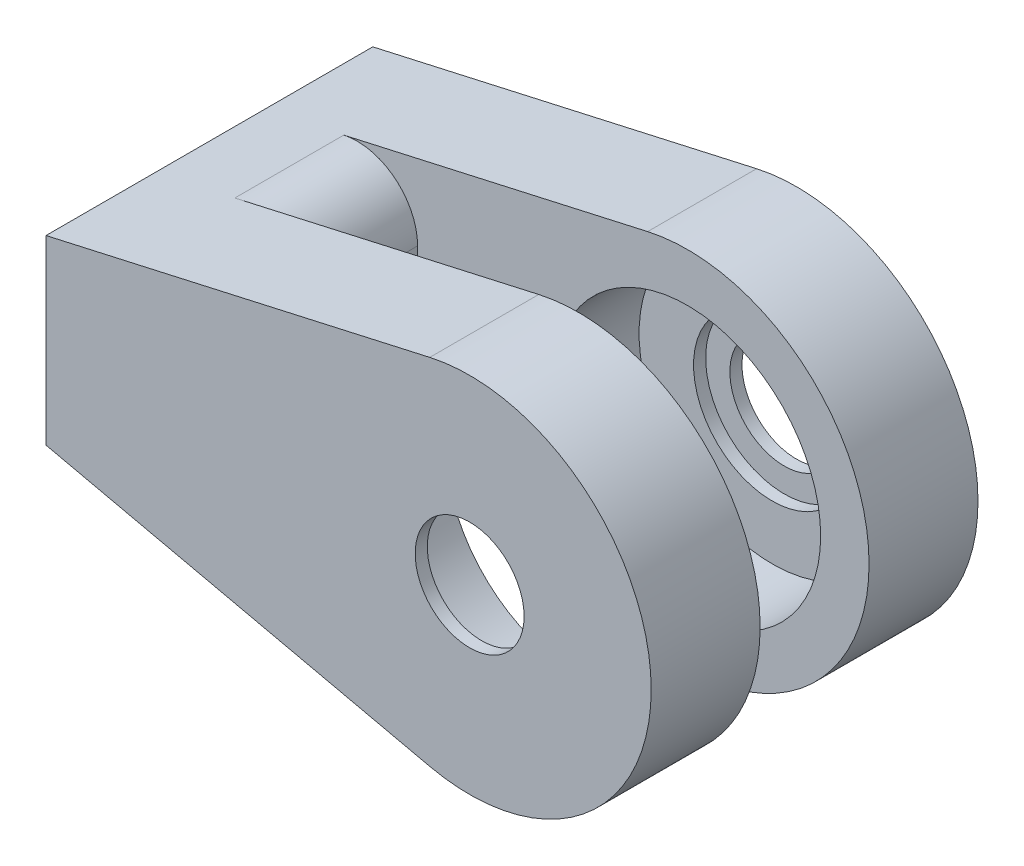
ISO-10303-21;
HEADER;
FILE_DESCRIPTION(('STEP AP214'),'2;1');
FILE_NAME('part.step','',(''),(''),'','','');
FILE_SCHEMA(('AUTOMOTIVE_DESIGN { 1 0 10303 214 1 1 1 1 }'));
ENDSEC;
DATA;
#1=APPLICATION_CONTEXT('core data for automotive mechanical design processes');
#2=APPLICATION_PROTOCOL_DEFINITION('international standard','automotive_design',2000,#1);
#3=PRODUCT_CONTEXT('',#1,'mechanical');
#4=PRODUCT('Part','Part','',(#3));
#5=PRODUCT_RELATED_PRODUCT_CATEGORY('part','',(#4));
#6=PRODUCT_DEFINITION_FORMATION('','',#4);
#7=PRODUCT_DEFINITION_CONTEXT('part definition',#1,'design');
#8=PRODUCT_DEFINITION('design','',#6,#7);
#9=PRODUCT_DEFINITION_SHAPE('','',#8);
#10=(LENGTH_UNIT() NAMED_UNIT(*) SI_UNIT(.MILLI.,.METRE.));
#11=(NAMED_UNIT(*) PLANE_ANGLE_UNIT() SI_UNIT($,.RADIAN.));
#12=(NAMED_UNIT(*) SI_UNIT($,.STERADIAN.) SOLID_ANGLE_UNIT());
#13=UNCERTAINTY_MEASURE_WITH_UNIT(LENGTH_MEASURE(1.E-05),#10,'distance_accuracy_value','');
#14=(GEOMETRIC_REPRESENTATION_CONTEXT(3) GLOBAL_UNCERTAINTY_ASSIGNED_CONTEXT((#13)) GLOBAL_UNIT_ASSIGNED_CONTEXT((#10,
#11,#12)) REPRESENTATION_CONTEXT('',''));
#15=CARTESIAN_POINT('',(0.,0.,0.));
#16=DIRECTION('',(0.,0.,1.));
#17=DIRECTION('',(1.,0.,0.));
#18=AXIS2_PLACEMENT_3D('',#15,#16,#17);
#19=CARTESIAN_POINT('',(0.,0.,-0.00100000000000013));
#20=DIRECTION('',(0.,0.,1.));
#21=DIRECTION('',(1.,0.,0.));
#22=AXIS2_PLACEMENT_3D('',#19,#20,#21);
#23=CYLINDRICAL_SURFACE('',#22,4.5);
#24=CARTESIAN_POINT('',(0.,0.,0.));
#25=DIRECTION('',(0.,0.,1.));
#26=DIRECTION('',(1.,0.,0.));
#27=AXIS2_PLACEMENT_3D('',#24,#25,#26);
#28=CIRCLE('',#27,4.5);
#29=CARTESIAN_POINT('',(4.5,0.,0.));
#30=VERTEX_POINT('',#29);
#31=EDGE_CURVE('E152',#30,#30,#28,.F.);
#32=ORIENTED_EDGE('',*,*,#31,.T.);
#33=EDGE_LOOP('',(#32));
#34=FACE_BOUND('',#33,.T.);
#35=CARTESIAN_POINT('',(0.,0.,1.));
#36=DIRECTION('',(0.,0.,1.));
#37=DIRECTION('',(1.,0.,0.));
#38=AXIS2_PLACEMENT_3D('',#35,#36,#37);
#39=CIRCLE('',#38,4.5);
#40=CARTESIAN_POINT('',(4.5,0.,1.));
#41=VERTEX_POINT('',#40);
#42=EDGE_CURVE('E48',#41,#41,#39,.F.);
#43=ORIENTED_EDGE('',*,*,#42,.F.);
#44=EDGE_LOOP('',(#43));
#45=FACE_BOUND('',#44,.T.);
#46=ADVANCED_FACE('F44',(#34,#45),#23,.F.);
#47=CARTESIAN_POINT('',(0.,0.,9.));
#48=DIRECTION('',(0.,0.,1.));
#49=DIRECTION('',(1.,0.,0.));
#50=AXIS2_PLACEMENT_3D('',#47,#48,#49);
#51=PLANE('',#50);
#52=CARTESIAN_POINT('',(0.,0.,9.));
#53=DIRECTION('',(0.,0.,1.));
#54=DIRECTION('',(1.,0.,0.));
#55=AXIS2_PLACEMENT_3D('',#52,#53,#54);
#56=CIRCLE('',#55,11.);
#57=CARTESIAN_POINT('',(11.,0.,9.));
#58=VERTEX_POINT('',#57);
#59=EDGE_CURVE('E156',#58,#58,#56,.T.);
#60=ORIENTED_EDGE('',*,*,#59,.F.);
#61=EDGE_LOOP('',(#60));
#62=FACE_BOUND('',#61,.T.);
#63=DIRECTION('',(-0.975609756097561,-0.219512195121951,0.));
#64=VECTOR('',#63,1.);
#65=CARTESIAN_POINT('',(-3.29268292682927,14.6341463414634,9.));
#66=LINE('',#65,#64);
#67=CARTESIAN_POINT('',(-3.29268292682927,14.6341463414634,9.));
#68=VERTEX_POINT('',#67);
#69=CARTESIAN_POINT('',(-28.3975609756098,8.9855487804878,9.));
#70=VERTEX_POINT('',#69);
#71=EDGE_CURVE('E167',#68,#70,#66,.T.);
#72=ORIENTED_EDGE('',*,*,#71,.T.);
#73=CARTESIAN_POINT('',(-27.3,4.1075,9.));
#74=DIRECTION('',(0.,0.,1.));
#75=DIRECTION('',(1.,0.,0.));
#76=AXIS2_PLACEMENT_3D('',#73,#74,#75);
#77=CIRCLE('',#76,5.);
#78=CARTESIAN_POINT('',(-22.3,4.1075,9.));
#79=VERTEX_POINT('',#78);
#80=EDGE_CURVE('E197',#70,#79,#77,.F.);
#81=ORIENTED_EDGE('',*,*,#80,.T.);
#82=DIRECTION('',(0.,-1.,0.));
#83=VECTOR('',#82,1.);
#84=CARTESIAN_POINT('',(-22.3,0.,9.));
#85=LINE('',#84,#83);
#86=CARTESIAN_POINT('',(-22.3,-4.1075,9.));
#87=VERTEX_POINT('',#86);
#88=EDGE_CURVE('E146',#79,#87,#85,.T.);
#89=ORIENTED_EDGE('',*,*,#88,.T.);
#90=CARTESIAN_POINT('',(-27.3,-4.1075,9.));
#91=DIRECTION('',(0.,0.,1.));
#92=DIRECTION('',(1.,0.,0.));
#93=AXIS2_PLACEMENT_3D('',#90,#91,#92);
#94=CIRCLE('',#93,5.);
#95=CARTESIAN_POINT('',(-28.3975609756098,-8.98554878048781,9.));
#96=VERTEX_POINT('',#95);
#97=EDGE_CURVE('E53',#87,#96,#94,.F.);
#98=ORIENTED_EDGE('',*,*,#97,.T.);
#99=DIRECTION('',(0.975609756097561,-0.219512195121951,0.));
#100=VECTOR('',#99,1.);
#101=CARTESIAN_POINT('',(-3.29268292682927,-14.6341463414634,9.));
#102=LINE('',#101,#100);
#103=CARTESIAN_POINT('',(-3.29268292682927,-14.6341463414634,9.));
#104=VERTEX_POINT('',#103);
#105=EDGE_CURVE('E61',#96,#104,#102,.T.);
#106=ORIENTED_EDGE('',*,*,#105,.T.);
#107=CARTESIAN_POINT('',(0.,0.,9.));
#108=DIRECTION('',(0.,0.,1.));
#109=DIRECTION('',(1.,0.,0.));
#110=AXIS2_PLACEMENT_3D('',#107,#108,#109);
#111=CIRCLE('',#110,15.);
#112=EDGE_CURVE('E164',#104,#68,#111,.T.);
#113=ORIENTED_EDGE('',*,*,#112,.T.);
#114=EDGE_LOOP('',(#72,#81,#89,#98,#106,#113));
#115=FACE_BOUND('',#114,.T.);
#116=ADVANCED_FACE('F255',(#62,#115),#51,.T.);
#117=CARTESIAN_POINT('',(-3.29268292682927,-14.6341463414634,9.));
#118=DIRECTION('',(0.219512195121951,0.975609756097561,0.));
#119=DIRECTION('',(-0.975609756097561,0.219512195121951,0.));
#120=AXIS2_PLACEMENT_3D('',#117,#118,#119);
#121=PLANE('',#120);
#122=ORIENTED_EDGE('',*,*,#105,.F.);
#123=DIRECTION('',(0.,0.,-1.));
#124=VECTOR('',#123,1.);
#125=CARTESIAN_POINT('',(-28.3975609756098,-8.98554878048781,18.));
#126=LINE('',#125,#124);
#127=CARTESIAN_POINT('',(-28.3975609756098,-8.98554878048781,18.));
#128=VERTEX_POINT('',#127);
#129=EDGE_CURVE('E126',#96,#128,#126,.F.);
#130=ORIENTED_EDGE('',*,*,#129,.T.);
#131=DIRECTION('',(0.975609756097561,-0.219512195121951,0.));
#132=VECTOR('',#131,1.);
#133=CARTESIAN_POINT('',(-3.29268292682927,-14.6341463414634,18.));
#134=LINE('',#133,#132);
#135=CARTESIAN_POINT('',(-3.29268292682927,-14.6341463414634,18.));
#136=VERTEX_POINT('',#135);
#137=EDGE_CURVE('E68',#128,#136,#134,.T.);
#138=ORIENTED_EDGE('',*,*,#137,.T.);
#139=DIRECTION('',(0.,0.,1.));
#140=VECTOR('',#139,1.);
#141=CARTESIAN_POINT('',(-3.29268292682927,-14.6341463414634,18.));
#142=LINE('',#141,#140);
#143=CARTESIAN_POINT('',(-3.29268292682927,-14.6341463414634,27.));
#144=VERTEX_POINT('',#143);
#145=EDGE_CURVE('E123',#136,#144,#142,.T.);
#146=ORIENTED_EDGE('',*,*,#145,.T.);
#147=DIRECTION('',(0.975609756097561,-0.219512195121951,0.));
#148=VECTOR('',#147,1.);
#149=CARTESIAN_POINT('',(-3.29268292682927,-14.6341463414634,27.));
#150=LINE('',#149,#148);
#151=CARTESIAN_POINT('',(-35.,-7.50000000000001,27.));
#152=VERTEX_POINT('',#151);
#153=EDGE_CURVE('E232',#152,#144,#150,.T.);
#154=ORIENTED_EDGE('',*,*,#153,.F.);
#155=DIRECTION('',(0.,0.,-1.));
#156=VECTOR('',#155,1.);
#157=CARTESIAN_POINT('',(-35.,-7.50000000000001,9.));
#158=LINE('',#157,#156);
#159=CARTESIAN_POINT('',(-35.,-7.50000000000001,0.));
#160=VERTEX_POINT('',#159);
#161=EDGE_CURVE('E169',#152,#160,#158,.T.);
#162=ORIENTED_EDGE('',*,*,#161,.T.);
#163=DIRECTION('',(0.975609756097561,-0.219512195121951,0.));
#164=VECTOR('',#163,1.);
#165=CARTESIAN_POINT('',(-3.29268292682927,-14.6341463414634,0.));
#166=LINE('',#165,#164);
#167=CARTESIAN_POINT('',(-3.29268292682927,-14.6341463414634,0.));
#168=VERTEX_POINT('',#167);
#169=EDGE_CURVE('E162',#160,#168,#166,.T.);
#170=ORIENTED_EDGE('',*,*,#169,.T.);
#171=DIRECTION('',(0.,0.,-1.));
#172=VECTOR('',#171,1.);
#173=CARTESIAN_POINT('',(-3.29268292682927,-14.6341463414634,9.));
#174=LINE('',#173,#172);
#175=EDGE_CURVE('E185',#104,#168,#174,.T.);
#176=ORIENTED_EDGE('',*,*,#175,.F.);
#177=EDGE_LOOP('',(#122,#130,#138,#146,#154,#162,#170,#176));
#178=FACE_BOUND('',#177,.T.);
#179=ADVANCED_FACE('F120',(#178),#121,.F.);
#180=CARTESIAN_POINT('',(0.,0.,9.));
#181=DIRECTION('',(0.,0.,-1.));
#182=DIRECTION('',(-1.,0.,0.));
#183=AXIS2_PLACEMENT_3D('',#180,#181,#182);
#184=CYLINDRICAL_SURFACE('',#183,15.);
#185=CARTESIAN_POINT('',(0.,0.,0.));
#186=DIRECTION('',(0.,0.,1.));
#187=DIRECTION('',(1.,0.,0.));
#188=AXIS2_PLACEMENT_3D('',#185,#186,#187);
#189=CIRCLE('',#188,15.);
#190=CARTESIAN_POINT('',(-3.29268292682927,14.6341463414634,0.));
#191=VERTEX_POINT('',#190);
#192=EDGE_CURVE('E172',#168,#191,#189,.T.);
#193=ORIENTED_EDGE('',*,*,#192,.T.);
#194=DIRECTION('',(0.,0.,-1.));
#195=VECTOR('',#194,1.);
#196=CARTESIAN_POINT('',(-3.29268292682927,14.6341463414634,9.));
#197=LINE('',#196,#195);
#198=EDGE_CURVE('E182',#68,#191,#197,.T.);
#199=ORIENTED_EDGE('',*,*,#198,.F.);
#200=ORIENTED_EDGE('',*,*,#112,.F.);
#201=ORIENTED_EDGE('',*,*,#175,.T.);
#202=EDGE_LOOP('',(#193,#199,#200,#201));
#203=FACE_BOUND('',#202,.T.);
#204=ADVANCED_FACE('F252',(#203),#184,.T.);
#205=CARTESIAN_POINT('',(-3.29268292682927,14.6341463414634,9.));
#206=DIRECTION('',(0.219512195121951,-0.975609756097561,0.));
#207=DIRECTION('',(0.975609756097561,0.219512195121951,0.));
#208=AXIS2_PLACEMENT_3D('',#205,#206,#207);
#209=PLANE('',#208);
#210=DIRECTION('',(0.,0.,-1.));
#211=VECTOR('',#210,1.);
#212=CARTESIAN_POINT('',(-28.3975609756098,8.9855487804878,9.));
#213=LINE('',#212,#211);
#214=CARTESIAN_POINT('',(-28.3975609756098,8.9855487804878,18.));
#215=VERTEX_POINT('',#214);
#216=EDGE_CURVE('E188',#215,#70,#213,.T.);
#217=ORIENTED_EDGE('',*,*,#216,.T.);
#218=ORIENTED_EDGE('',*,*,#71,.F.);
#219=ORIENTED_EDGE('',*,*,#198,.T.);
#220=DIRECTION('',(-0.975609756097561,-0.219512195121951,0.));
#221=VECTOR('',#220,1.);
#222=CARTESIAN_POINT('',(-3.29268292682927,14.6341463414634,0.));
#223=LINE('',#222,#221);
#224=CARTESIAN_POINT('',(-35.,7.49999999999999,0.));
#225=VERTEX_POINT('',#224);
#226=EDGE_CURVE('E174',#191,#225,#223,.T.);
#227=ORIENTED_EDGE('',*,*,#226,.T.);
#228=DIRECTION('',(0.,0.,-1.));
#229=VECTOR('',#228,1.);
#230=CARTESIAN_POINT('',(-35.,7.49999999999999,9.));
#231=LINE('',#230,#229);
#232=CARTESIAN_POINT('',(-35.,7.49999999999999,27.));
#233=VERTEX_POINT('',#232);
#234=EDGE_CURVE('E179',#233,#225,#231,.T.);
#235=ORIENTED_EDGE('',*,*,#234,.F.);
#236=DIRECTION('',(-0.975609756097561,-0.219512195121951,0.));
#237=VECTOR('',#236,1.);
#238=CARTESIAN_POINT('',(-3.29268292682927,14.6341463414634,27.));
#239=LINE('',#238,#237);
#240=CARTESIAN_POINT('',(-3.29268292682927,14.6341463414634,27.));
#241=VERTEX_POINT('',#240);
#242=EDGE_CURVE('E237',#241,#233,#239,.T.);
#243=ORIENTED_EDGE('',*,*,#242,.F.);
#244=DIRECTION('',(0.,0.,1.));
#245=VECTOR('',#244,1.);
#246=CARTESIAN_POINT('',(-3.29268292682927,14.6341463414634,18.));
#247=LINE('',#246,#245);
#248=CARTESIAN_POINT('',(-3.29268292682927,14.6341463414634,18.));
#249=VERTEX_POINT('',#248);
#250=EDGE_CURVE('E143',#249,#241,#247,.T.);
#251=ORIENTED_EDGE('',*,*,#250,.F.);
#252=DIRECTION('',(-0.975609756097561,-0.219512195121951,0.));
#253=VECTOR('',#252,1.);
#254=CARTESIAN_POINT('',(-3.29268292682927,14.6341463414634,18.));
#255=LINE('',#254,#253);
#256=EDGE_CURVE('E134',#249,#215,#255,.T.);
#257=ORIENTED_EDGE('',*,*,#256,.T.);
#258=EDGE_LOOP('',(#217,#218,#219,#227,#235,#243,#251,#257));
#259=FACE_BOUND('',#258,.T.);
#260=ADVANCED_FACE('F269',(#259),#209,.F.);
#261=CARTESIAN_POINT('',(-35.,0.,9.));
#262=DIRECTION('',(1.,0.,0.));
#263=DIRECTION('',(0.,1.,0.));
#264=AXIS2_PLACEMENT_3D('',#261,#262,#263);
#265=PLANE('',#264);
#266=CARTESIAN_POINT('',(-35.,0.,13.5));
#267=DIRECTION('',(-1.,0.,0.));
#268=DIRECTION('',(0.,0.,1.));
#269=AXIS2_PLACEMENT_3D('',#266,#267,#268);
#270=CIRCLE('',#269,5.03125);
#271=CARTESIAN_POINT('',(-35.,0.,18.53125));
#272=VERTEX_POINT('',#271);
#273=EDGE_CURVE('E215',#272,#272,#270,.T.);
#274=ORIENTED_EDGE('',*,*,#273,.F.);
#275=EDGE_LOOP('',(#274));
#276=FACE_BOUND('',#275,.T.);
#277=DIRECTION('',(0.,-1.,0.));
#278=VECTOR('',#277,1.);
#279=CARTESIAN_POINT('',(-35.,0.,0.));
#280=LINE('',#279,#278);
#281=EDGE_CURVE('E165',#225,#160,#280,.T.);
#282=ORIENTED_EDGE('',*,*,#281,.T.);
#283=ORIENTED_EDGE('',*,*,#161,.F.);
#284=DIRECTION('',(0.,-1.,0.));
#285=VECTOR('',#284,1.);
#286=CARTESIAN_POINT('',(-35.,0.,27.));
#287=LINE('',#286,#285);
#288=EDGE_CURVE('E129',#233,#152,#287,.T.);
#289=ORIENTED_EDGE('',*,*,#288,.F.);
#290=ORIENTED_EDGE('',*,*,#234,.T.);
#291=EDGE_LOOP('',(#282,#283,#289,#290));
#292=FACE_BOUND('',#291,.T.);
#293=ADVANCED_FACE('F270',(#276,#292),#265,.F.);
#294=CARTESIAN_POINT('',(0.,0.,0.));
#295=DIRECTION('',(0.,0.,1.));
#296=DIRECTION('',(1.,0.,0.));
#297=AXIS2_PLACEMENT_3D('',#294,#295,#296);
#298=PLANE('',#297);
#299=ORIENTED_EDGE('',*,*,#31,.F.);
#300=EDGE_LOOP('',(#299));
#301=FACE_BOUND('',#300,.T.);
#302=ORIENTED_EDGE('',*,*,#169,.F.);
#303=ORIENTED_EDGE('',*,*,#281,.F.);
#304=ORIENTED_EDGE('',*,*,#226,.F.);
#305=ORIENTED_EDGE('',*,*,#192,.F.);
#306=EDGE_LOOP('',(#302,#303,#304,#305));
#307=FACE_BOUND('',#306,.T.);
#308=ADVANCED_FACE('F247',(#301,#307),#298,.F.);
#309=CARTESIAN_POINT('',(0.,0.,-31.1126983722081));
#310=DIRECTION('',(0.,0.,1.));
#311=DIRECTION('',(1.,0.,0.));
#312=AXIS2_PLACEMENT_3D('',#309,#310,#311);
#313=CYLINDRICAL_SURFACE('',#312,11.);
#314=CARTESIAN_POINT('',(0.,0.,2.));
#315=DIRECTION('',(0.,0.,1.));
#316=DIRECTION('',(1.,0.,0.));
#317=AXIS2_PLACEMENT_3D('',#314,#315,#316);
#318=CIRCLE('',#317,11.);
#319=CARTESIAN_POINT('',(11.,0.,1.99999999999999));
#320=VERTEX_POINT('',#319);
#321=EDGE_CURVE('E159',#320,#320,#318,.F.);
#322=CARTESIAN_POINT('',(11.,0.,1.99999999999999));
#323=CARTESIAN_POINT('',(11.,0.,2.07291666666666));
#324=CARTESIAN_POINT('',(11.,0.,2.14583333333333));
#325=CARTESIAN_POINT('',(11.,0.,2.29166666666666));
#326=CARTESIAN_POINT('',(11.,0.,2.36458333333333));
#327=CARTESIAN_POINT('',(11.,0.,2.51041666666666));
#328=CARTESIAN_POINT('',(11.,0.,2.58333333333333));
#329=CARTESIAN_POINT('',(11.,0.,2.72916666666666));
#330=CARTESIAN_POINT('',(11.,0.,2.80208333333333));
#331=CARTESIAN_POINT('',(11.,0.,2.94791666666666));
#332=CARTESIAN_POINT('',(11.,0.,3.02083333333333));
#333=CARTESIAN_POINT('',(11.,0.,3.16666666666666));
#334=CARTESIAN_POINT('',(11.,0.,3.23958333333333));
#335=CARTESIAN_POINT('',(11.,0.,3.38541666666666));
#336=CARTESIAN_POINT('',(11.,0.,3.45833333333333));
#337=CARTESIAN_POINT('',(11.,0.,3.60416666666666));
#338=CARTESIAN_POINT('',(11.,0.,3.67708333333333));
#339=CARTESIAN_POINT('',(11.,0.,3.82291666666666));
#340=CARTESIAN_POINT('',(11.,0.,3.89583333333333));
#341=CARTESIAN_POINT('',(11.,0.,4.04166666666667));
#342=CARTESIAN_POINT('',(11.,0.,4.11458333333333));
#343=CARTESIAN_POINT('',(11.,0.,4.26041666666666));
#344=CARTESIAN_POINT('',(11.,0.,4.33333333333333));
#345=CARTESIAN_POINT('',(11.,0.,4.47916666666666));
#346=CARTESIAN_POINT('',(11.,0.,4.55208333333333));
#347=CARTESIAN_POINT('',(11.,0.,4.69791666666667));
#348=CARTESIAN_POINT('',(11.,0.,4.77083333333333));
#349=CARTESIAN_POINT('',(11.,0.,4.91666666666667));
#350=CARTESIAN_POINT('',(11.,0.,4.98958333333333));
#351=CARTESIAN_POINT('',(11.,0.,5.13541666666666));
#352=CARTESIAN_POINT('',(11.,0.,5.20833333333333));
#353=CARTESIAN_POINT('',(11.,0.,5.35416666666666));
#354=CARTESIAN_POINT('',(11.,0.,5.42708333333333));
#355=CARTESIAN_POINT('',(11.,0.,5.57291666666667));
#356=CARTESIAN_POINT('',(11.,0.,5.64583333333333));
#357=CARTESIAN_POINT('',(11.,0.,5.79166666666667));
#358=CARTESIAN_POINT('',(11.,0.,5.86458333333333));
#359=CARTESIAN_POINT('',(11.,0.,6.01041666666666));
#360=CARTESIAN_POINT('',(11.,0.,6.08333333333333));
#361=CARTESIAN_POINT('',(11.,0.,6.22916666666666));
#362=CARTESIAN_POINT('',(11.,0.,6.30208333333333));
#363=CARTESIAN_POINT('',(11.,0.,6.44791666666667));
#364=CARTESIAN_POINT('',(11.,0.,6.52083333333333));
#365=CARTESIAN_POINT('',(11.,0.,6.66666666666667));
#366=CARTESIAN_POINT('',(11.,0.,6.73958333333333));
#367=CARTESIAN_POINT('',(11.,0.,6.88541666666666));
#368=CARTESIAN_POINT('',(11.,0.,6.95833333333333));
#369=CARTESIAN_POINT('',(11.,0.,7.10416666666666));
#370=CARTESIAN_POINT('',(11.,0.,7.17708333333333));
#371=CARTESIAN_POINT('',(11.,0.,7.32291666666667));
#372=CARTESIAN_POINT('',(11.,0.,7.39583333333333));
#373=CARTESIAN_POINT('',(11.,0.,7.54166666666667));
#374=CARTESIAN_POINT('',(11.,0.,7.61458333333333));
#375=CARTESIAN_POINT('',(11.,0.,7.76041666666667));
#376=CARTESIAN_POINT('',(11.,0.,7.83333333333333));
#377=CARTESIAN_POINT('',(11.,0.,7.97916666666666));
#378=CARTESIAN_POINT('',(11.,0.,8.05208333333333));
#379=CARTESIAN_POINT('',(11.,0.,8.19791666666667));
#380=CARTESIAN_POINT('',(11.,0.,8.27083333333334));
#381=CARTESIAN_POINT('',(11.,0.,8.41666666666667));
#382=CARTESIAN_POINT('',(11.,0.,8.48958333333334));
#383=CARTESIAN_POINT('',(11.,0.,8.63541666666667));
#384=CARTESIAN_POINT('',(11.,0.,8.70833333333333));
#385=CARTESIAN_POINT('',(11.,0.,8.85416666666666));
#386=CARTESIAN_POINT('',(11.,0.,8.92708333333333));
#387=CARTESIAN_POINT('',(11.,0.,9.));
#388=B_SPLINE_CURVE_WITH_KNOTS('',3,(#322,#323,#324,#325,#326,#327,#328,#329,#330,#331,#332,
#333,#334,#335,#336,#337,#338,#339,#340,#341,#342,#343,#344,#345,#346,#347,#348,#349,#350,#351,
#352,#353,#354,#355,#356,#357,#358,#359,#360,#361,#362,#363,#364,#365,#366,#367,#368,#369,#370,
#371,#372,#373,#374,#375,#376,#377,#378,#379,#380,#381,#382,#383,#384,#385,#386,#387),
.UNSPECIFIED.,.F.,.F.,(4,2,2,2,2,2,2,2,2,2,2,2,2,2,2,2,2,2,2,2,2,2,2,2,2,2,2,2,2,2,2,2,4),(0.,
0.218750000000004,0.4375,0.656249999999997,0.875000000000001,1.09375,1.3125,1.53125,1.75,
1.96875000000001,2.1875,2.40625,2.625,2.84375000000001,3.0625,3.28125,3.5,3.71875000000001,
3.9375,4.15625,4.375,4.59375000000001,4.8125,5.03125,5.25,5.46875000000001,5.68750000000001,
5.90625,6.12500000000001,6.34375000000001,6.56250000000001,6.78125,7.00000000000001),.UNSPECIFIED.);
#389=EDGE_CURVE('BSEAM279',#320,#58,#388,.T.);
#390=ORIENTED_EDGE('',*,*,#321,.T.);
#391=ORIENTED_EDGE('',*,*,#59,.T.);
#392=ORIENTED_EDGE('',*,*,#389,.T.);
#393=ORIENTED_EDGE('',*,*,#389,.F.);
#394=EDGE_LOOP('',(#390,#392,#391,#393));
#395=FACE_BOUND('',#394,.T.);
#396=ADVANCED_FACE('F279',(#395),#313,.F.);
#397=CARTESIAN_POINT('',(0.,0.,2.));
#398=DIRECTION('',(0.,0.,1.));
#399=DIRECTION('',(1.,0.,0.));
#400=AXIS2_PLACEMENT_3D('',#397,#398,#399);
#401=PLANE('',#400);
#402=CARTESIAN_POINT('',(0.,0.,2.));
#403=DIRECTION('',(0.,0.,1.));
#404=DIRECTION('',(1.,0.,0.));
#405=AXIS2_PLACEMENT_3D('',#402,#403,#404);
#406=CIRCLE('',#405,6.5);
#407=CARTESIAN_POINT('',(6.5,0.,2.));
#408=VERTEX_POINT('',#407);
#409=EDGE_CURVE('E207',#408,#408,#406,.T.);
#410=ORIENTED_EDGE('',*,*,#409,.F.);
#411=EDGE_LOOP('',(#410));
#412=FACE_BOUND('',#411,.T.);
#413=ORIENTED_EDGE('',*,*,#321,.F.);
#414=EDGE_LOOP('',(#413));
#415=FACE_BOUND('',#414,.T.);
#416=ADVANCED_FACE('F299',(#412,#415),#401,.T.);
#417=CARTESIAN_POINT('',(-22.3,0.,27.002));
#418=DIRECTION('',(1.,0.,0.));
#419=DIRECTION('',(0.,1.,0.));
#420=AXIS2_PLACEMENT_3D('',#417,#418,#419);
#421=PLANE('',#420);
#422=ORIENTED_EDGE('',*,*,#88,.F.);
#423=DIRECTION('',(0.,0.,-1.));
#424=VECTOR('',#423,1.);
#425=CARTESIAN_POINT('',(-22.3,4.1075,18.));
#426=LINE('',#425,#424);
#427=CARTESIAN_POINT('',(-22.3,4.1075,18.));
#428=VERTEX_POINT('',#427);
#429=EDGE_CURVE('E194',#79,#428,#426,.F.);
#430=ORIENTED_EDGE('',*,*,#429,.T.);
#431=DIRECTION('',(0.,1.,0.));
#432=VECTOR('',#431,1.);
#433=CARTESIAN_POINT('',(-22.3,0.,18.));
#434=LINE('',#433,#432);
#435=CARTESIAN_POINT('',(-22.3,-4.1075,18.));
#436=VERTEX_POINT('',#435);
#437=EDGE_CURVE('E142',#436,#428,#434,.T.);
#438=ORIENTED_EDGE('',*,*,#437,.F.);
#439=DIRECTION('',(0.,0.,-1.));
#440=VECTOR('',#439,1.);
#441=CARTESIAN_POINT('',(-22.3,-4.1075,9.));
#442=LINE('',#441,#440);
#443=EDGE_CURVE('E191',#436,#87,#442,.T.);
#444=ORIENTED_EDGE('',*,*,#443,.T.);
#445=EDGE_LOOP('',(#422,#430,#438,#444));
#446=FACE_BOUND('',#445,.T.);
#447=ADVANCED_FACE('F263',(#446),#421,.T.);
#448=CARTESIAN_POINT('',(0.,0.,18.));
#449=DIRECTION('',(0.,0.,1.));
#450=DIRECTION('',(-1.,0.,0.));
#451=AXIS2_PLACEMENT_3D('',#448,#449,#450);
#452=CYLINDRICAL_SURFACE('',#451,15.);
#453=CARTESIAN_POINT('',(0.,0.,27.));
#454=DIRECTION('',(0.,0.,1.));
#455=DIRECTION('',(1.,0.,0.));
#456=AXIS2_PLACEMENT_3D('',#453,#454,#455);
#457=CIRCLE('',#456,15.);
#458=EDGE_CURVE('E141',#144,#241,#457,.T.);
#459=ORIENTED_EDGE('',*,*,#458,.F.);
#460=ORIENTED_EDGE('',*,*,#145,.F.);
#461=CARTESIAN_POINT('',(0.,0.,18.));
#462=DIRECTION('',(0.,0.,1.));
#463=DIRECTION('',(1.,0.,0.));
#464=AXIS2_PLACEMENT_3D('',#461,#462,#463);
#465=CIRCLE('',#464,15.);
#466=EDGE_CURVE('E128',#136,#249,#465,.T.);
#467=ORIENTED_EDGE('',*,*,#466,.T.);
#468=ORIENTED_EDGE('',*,*,#250,.T.);
#469=EDGE_LOOP('',(#459,#460,#467,#468));
#470=FACE_BOUND('',#469,.T.);
#471=ADVANCED_FACE('F139',(#470),#452,.T.);
#472=CARTESIAN_POINT('',(0.,0.,18.));
#473=DIRECTION('',(0.,0.,-1.));
#474=DIRECTION('',(1.,0.,0.));
#475=AXIS2_PLACEMENT_3D('',#472,#473,#474);
#476=PLANE('',#475);
#477=CARTESIAN_POINT('',(0.,0.,18.));
#478=DIRECTION('',(0.,0.,1.));
#479=DIRECTION('',(1.,0.,0.));
#480=AXIS2_PLACEMENT_3D('',#477,#478,#479);
#481=CIRCLE('',#480,11.);
#482=CARTESIAN_POINT('',(11.,0.,18.));
#483=VERTEX_POINT('',#482);
#484=EDGE_CURVE('E227',#483,#483,#481,.T.);
#485=ORIENTED_EDGE('',*,*,#484,.T.);
#486=EDGE_LOOP('',(#485));
#487=FACE_BOUND('',#486,.T.);
#488=ORIENTED_EDGE('',*,*,#137,.F.);
#489=CARTESIAN_POINT('',(-27.3,-4.1075,18.));
#490=DIRECTION('',(0.,0.,-1.));
#491=DIRECTION('',(-1.,0.,0.));
#492=AXIS2_PLACEMENT_3D('',#489,#490,#491);
#493=CIRCLE('',#492,5.);
#494=EDGE_CURVE('E13',#128,#436,#493,.F.);
#495=ORIENTED_EDGE('',*,*,#494,.T.);
#496=ORIENTED_EDGE('',*,*,#437,.T.);
#497=CARTESIAN_POINT('',(-27.3,4.1075,18.));
#498=DIRECTION('',(0.,0.,-1.));
#499=DIRECTION('',(-1.,0.,0.));
#500=AXIS2_PLACEMENT_3D('',#497,#498,#499);
#501=CIRCLE('',#500,5.);
#502=EDGE_CURVE('E199',#428,#215,#501,.F.);
#503=ORIENTED_EDGE('',*,*,#502,.T.);
#504=ORIENTED_EDGE('',*,*,#256,.F.);
#505=ORIENTED_EDGE('',*,*,#466,.F.);
#506=EDGE_LOOP('',(#488,#495,#496,#503,#504,#505));
#507=FACE_BOUND('',#506,.T.);
#508=ADVANCED_FACE('F132',(#487,#507),#476,.T.);
#509=CARTESIAN_POINT('',(0.,0.,27.));
#510=DIRECTION('',(0.,0.,-1.));
#511=DIRECTION('',(1.,0.,0.));
#512=AXIS2_PLACEMENT_3D('',#509,#510,#511);
#513=PLANE('',#512);
#514=CARTESIAN_POINT('',(0.,0.,27.));
#515=DIRECTION('',(0.,0.,1.));
#516=DIRECTION('',(1.,0.,0.));
#517=AXIS2_PLACEMENT_3D('',#514,#515,#516);
#518=CIRCLE('',#517,4.5);
#519=CARTESIAN_POINT('',(4.5,0.,27.));
#520=VERTEX_POINT('',#519);
#521=EDGE_CURVE('E222',#520,#520,#518,.F.);
#522=ORIENTED_EDGE('',*,*,#521,.T.);
#523=EDGE_LOOP('',(#522));
#524=FACE_BOUND('',#523,.T.);
#525=ORIENTED_EDGE('',*,*,#153,.T.);
#526=ORIENTED_EDGE('',*,*,#458,.T.);
#527=ORIENTED_EDGE('',*,*,#242,.T.);
#528=ORIENTED_EDGE('',*,*,#288,.T.);
#529=EDGE_LOOP('',(#525,#526,#527,#528));
#530=FACE_BOUND('',#529,.T.);
#531=ADVANCED_FACE('F242',(#524,#530),#513,.F.);
#532=CARTESIAN_POINT('',(0.,0.,58.1126983722081));
#533=DIRECTION('',(0.,0.,-1.));
#534=DIRECTION('',(1.,0.,0.));
#535=AXIS2_PLACEMENT_3D('',#532,#533,#534);
#536=CYLINDRICAL_SURFACE('',#535,11.);
#537=CARTESIAN_POINT('',(0.,0.,25.));
#538=DIRECTION('',(0.,0.,1.));
#539=DIRECTION('',(1.,0.,0.));
#540=AXIS2_PLACEMENT_3D('',#537,#538,#539);
#541=CIRCLE('',#540,11.);
#542=CARTESIAN_POINT('',(11.,0.,25.));
#543=VERTEX_POINT('',#542);
#544=EDGE_CURVE('E230',#543,#543,#541,.F.);
#545=CARTESIAN_POINT('',(11.,0.,25.));
#546=CARTESIAN_POINT('',(11.,0.,24.9270833333333));
#547=CARTESIAN_POINT('',(11.,0.,24.8541666666667));
#548=CARTESIAN_POINT('',(11.,0.,24.7083333333333));
#549=CARTESIAN_POINT('',(11.,0.,24.6354166666667));
#550=CARTESIAN_POINT('',(11.,0.,24.4895833333333));
#551=CARTESIAN_POINT('',(11.,0.,24.4166666666667));
#552=CARTESIAN_POINT('',(11.,0.,24.2708333333333));
#553=CARTESIAN_POINT('',(11.,0.,24.1979166666667));
#554=CARTESIAN_POINT('',(11.,0.,24.0520833333333));
#555=CARTESIAN_POINT('',(11.,0.,23.9791666666667));
#556=CARTESIAN_POINT('',(11.,0.,23.8333333333333));
#557=CARTESIAN_POINT('',(11.,0.,23.7604166666667));
#558=CARTESIAN_POINT('',(11.,0.,23.6145833333333));
#559=CARTESIAN_POINT('',(11.,0.,23.5416666666667));
#560=CARTESIAN_POINT('',(11.,0.,23.3958333333333));
#561=CARTESIAN_POINT('',(11.,0.,23.3229166666667));
#562=CARTESIAN_POINT('',(11.,0.,23.1770833333333));
#563=CARTESIAN_POINT('',(11.,0.,23.1041666666667));
#564=CARTESIAN_POINT('',(11.,0.,22.9583333333333));
#565=CARTESIAN_POINT('',(11.,0.,22.8854166666667));
#566=CARTESIAN_POINT('',(11.,0.,22.7395833333333));
#567=CARTESIAN_POINT('',(11.,0.,22.6666666666667));
#568=CARTESIAN_POINT('',(11.,0.,22.5208333333333));
#569=CARTESIAN_POINT('',(11.,0.,22.4479166666667));
#570=CARTESIAN_POINT('',(11.,0.,22.3020833333333));
#571=CARTESIAN_POINT('',(11.,0.,22.2291666666667));
#572=CARTESIAN_POINT('',(11.,0.,22.0833333333333));
#573=CARTESIAN_POINT('',(11.,0.,22.0104166666667));
#574=CARTESIAN_POINT('',(11.,0.,21.8645833333333));
#575=CARTESIAN_POINT('',(11.,0.,21.7916666666667));
#576=CARTESIAN_POINT('',(11.,0.,21.6458333333333));
#577=CARTESIAN_POINT('',(11.,0.,21.5729166666667));
#578=CARTESIAN_POINT('',(11.,0.,21.4270833333333));
#579=CARTESIAN_POINT('',(11.,0.,21.3541666666667));
#580=CARTESIAN_POINT('',(11.,0.,21.2083333333333));
#581=CARTESIAN_POINT('',(11.,0.,21.1354166666667));
#582=CARTESIAN_POINT('',(11.,0.,20.9895833333333));
#583=CARTESIAN_POINT('',(11.,0.,20.9166666666667));
#584=CARTESIAN_POINT('',(11.,0.,20.7708333333333));
#585=CARTESIAN_POINT('',(11.,0.,20.6979166666667));
#586=CARTESIAN_POINT('',(11.,0.,20.5520833333333));
#587=CARTESIAN_POINT('',(11.,0.,20.4791666666667));
#588=CARTESIAN_POINT('',(11.,0.,20.3333333333333));
#589=CARTESIAN_POINT('',(11.,0.,20.2604166666667));
#590=CARTESIAN_POINT('',(11.,0.,20.1145833333333));
#591=CARTESIAN_POINT('',(11.,0.,20.0416666666667));
#592=CARTESIAN_POINT('',(11.,0.,19.8958333333333));
#593=CARTESIAN_POINT('',(11.,0.,19.8229166666667));
#594=CARTESIAN_POINT('',(11.,0.,19.6770833333333));
#595=CARTESIAN_POINT('',(11.,0.,19.6041666666667));
#596=CARTESIAN_POINT('',(11.,0.,19.4583333333333));
#597=CARTESIAN_POINT('',(11.,0.,19.3854166666667));
#598=CARTESIAN_POINT('',(11.,0.,19.2395833333333));
#599=CARTESIAN_POINT('',(11.,0.,19.1666666666667));
#600=CARTESIAN_POINT('',(11.,0.,19.0208333333333));
#601=CARTESIAN_POINT('',(11.,0.,18.9479166666667));
#602=CARTESIAN_POINT('',(11.,0.,18.8020833333333));
#603=CARTESIAN_POINT('',(11.,0.,18.7291666666667));
#604=CARTESIAN_POINT('',(11.,0.,18.5833333333333));
#605=CARTESIAN_POINT('',(11.,0.,18.5104166666667));
#606=CARTESIAN_POINT('',(11.,0.,18.3645833333333));
#607=CARTESIAN_POINT('',(11.,0.,18.2916666666667));
#608=CARTESIAN_POINT('',(11.,0.,18.1458333333333));
#609=CARTESIAN_POINT('',(11.,0.,18.0729166666667));
#610=CARTESIAN_POINT('',(11.,0.,18.));
#611=B_SPLINE_CURVE_WITH_KNOTS('',3,(#545,#546,#547,#548,#549,#550,#551,#552,#553,#554,#555,
#556,#557,#558,#559,#560,#561,#562,#563,#564,#565,#566,#567,#568,#569,#570,#571,#572,#573,#574,
#575,#576,#577,#578,#579,#580,#581,#582,#583,#584,#585,#586,#587,#588,#589,#590,#591,#592,#593,
#594,#595,#596,#597,#598,#599,#600,#601,#602,#603,#604,#605,#606,#607,#608,#609,#610),
.UNSPECIFIED.,.F.,.F.,(4,2,2,2,2,2,2,2,2,2,2,2,2,2,2,2,2,2,2,2,2,2,2,2,2,2,2,2,2,2,2,2,4),(0.,
0.218749999999997,0.4375,0.656249999999997,0.875000000000001,1.09375,1.3125,1.53125,1.75,
1.96875,2.1875,2.40625,2.625,2.84375,3.0625,3.28125,3.5,3.71874999999999,3.9375,
4.15624999999999,4.375,4.59374999999999,4.8125,5.03124999999999,5.24999999999999,
5.46874999999999,5.68749999999999,5.90624999999999,6.12499999999999,6.34375,6.56249999999999,
6.78124999999999,6.99999999999999),.UNSPECIFIED.);
#612=EDGE_CURVE('BSEAM332',#543,#483,#611,.T.);
#613=ORIENTED_EDGE('',*,*,#544,.F.);
#614=ORIENTED_EDGE('',*,*,#484,.F.);
#615=ORIENTED_EDGE('',*,*,#612,.T.);
#616=ORIENTED_EDGE('',*,*,#612,.F.);
#617=EDGE_LOOP('',(#613,#615,#614,#616));
#618=FACE_BOUND('',#617,.T.);
#619=ADVANCED_FACE('F332',(#618),#536,.F.);
#620=CARTESIAN_POINT('',(0.,0.,25.));
#621=DIRECTION('',(0.,0.,-1.));
#622=DIRECTION('',(1.,0.,0.));
#623=AXIS2_PLACEMENT_3D('',#620,#621,#622);
#624=PLANE('',#623);
#625=CARTESIAN_POINT('',(0.,0.,25.));
#626=DIRECTION('',(0.,0.,-1.));
#627=DIRECTION('',(-1.,0.,0.));
#628=AXIS2_PLACEMENT_3D('',#625,#626,#627);
#629=CIRCLE('',#628,6.5);
#630=CARTESIAN_POINT('',(-6.5,0.,25.));
#631=VERTEX_POINT('',#630);
#632=EDGE_CURVE('E204',#631,#631,#629,.T.);
#633=ORIENTED_EDGE('',*,*,#632,.F.);
#634=EDGE_LOOP('',(#633));
#635=FACE_BOUND('',#634,.T.);
#636=ORIENTED_EDGE('',*,*,#544,.T.);
#637=EDGE_LOOP('',(#636));
#638=FACE_BOUND('',#637,.T.);
#639=ADVANCED_FACE('F339',(#635,#638),#624,.T.);
#640=CARTESIAN_POINT('',(0.,0.,27.001));
#641=DIRECTION('',(0.,0.,-1.));
#642=DIRECTION('',(1.,0.,0.));
#643=AXIS2_PLACEMENT_3D('',#640,#641,#642);
#644=CYLINDRICAL_SURFACE('',#643,4.5);
#645=CARTESIAN_POINT('',(0.,0.,26.));
#646=DIRECTION('',(0.,0.,1.));
#647=DIRECTION('',(1.,0.,0.));
#648=AXIS2_PLACEMENT_3D('',#645,#646,#647);
#649=CIRCLE('',#648,4.5);
#650=CARTESIAN_POINT('',(4.5,0.,26.));
#651=VERTEX_POINT('',#650);
#652=EDGE_CURVE('E202',#651,#651,#649,.F.);
#653=ORIENTED_EDGE('',*,*,#652,.T.);
#654=EDGE_LOOP('',(#653));
#655=FACE_BOUND('',#654,.T.);
#656=ORIENTED_EDGE('',*,*,#521,.F.);
#657=EDGE_LOOP('',(#656));
#658=FACE_BOUND('',#657,.T.);
#659=ADVANCED_FACE('F352',(#655,#658),#644,.F.);
#660=CARTESIAN_POINT('',(-23.57,0.,13.5));
#661=DIRECTION('',(-1.,0.,0.));
#662=DIRECTION('',(0.,0.,1.));
#663=AXIS2_PLACEMENT_3D('',#660,#661,#662);
#664=CYLINDRICAL_SURFACE('',#663,5.03125);
#665=CARTESIAN_POINT('',(-23.57,0.,13.5));
#666=DIRECTION('',(-1.,0.,0.));
#667=DIRECTION('',(0.,0.,1.));
#668=AXIS2_PLACEMENT_3D('',#665,#666,#667);
#669=CIRCLE('',#668,5.03125);
#670=CARTESIAN_POINT('',(-23.57,0.,18.53125));
#671=VERTEX_POINT('',#670);
#672=EDGE_CURVE('E219',#671,#671,#669,.T.);
#673=ORIENTED_EDGE('',*,*,#672,.F.);
#674=EDGE_LOOP('',(#673));
#675=FACE_BOUND('',#674,.T.);
#676=ORIENTED_EDGE('',*,*,#273,.T.);
#677=EDGE_LOOP('',(#676));
#678=FACE_BOUND('',#677,.T.);
#679=ADVANCED_FACE('F362',(#675,#678),#664,.F.);
#680=CARTESIAN_POINT('',(-23.57,0.,0.));
#681=DIRECTION('',(-1.,0.,0.));
#682=DIRECTION('',(0.,0.,1.));
#683=AXIS2_PLACEMENT_3D('',#680,#681,#682);
#684=PLANE('',#683);
#685=ORIENTED_EDGE('',*,*,#672,.T.);
#686=EDGE_LOOP('',(#685));
#687=FACE_BOUND('',#686,.T.);
#688=ADVANCED_FACE('F379',(#687),#684,.T.);
#689=CARTESIAN_POINT('',(-27.3,4.1075,9.));
#690=DIRECTION('',(0.,0.,1.));
#691=DIRECTION('',(1.,0.,0.));
#692=AXIS2_PLACEMENT_3D('',#689,#690,#691);
#693=CYLINDRICAL_SURFACE('',#692,5.);
#694=ORIENTED_EDGE('',*,*,#502,.F.);
#695=ORIENTED_EDGE('',*,*,#429,.F.);
#696=ORIENTED_EDGE('',*,*,#80,.F.);
#697=ORIENTED_EDGE('',*,*,#216,.F.);
#698=EDGE_LOOP('',(#694,#695,#696,#697));
#699=FACE_BOUND('',#698,.T.);
#700=ADVANCED_FACE('F266',(#699),#693,.T.);
#701=CARTESIAN_POINT('',(-27.3,-4.1075,27.002));
#702=DIRECTION('',(0.,0.,1.));
#703=DIRECTION('',(1.,0.,0.));
#704=AXIS2_PLACEMENT_3D('',#701,#702,#703);
#705=CYLINDRICAL_SURFACE('',#704,5.);
#706=ORIENTED_EDGE('',*,*,#494,.F.);
#707=ORIENTED_EDGE('',*,*,#129,.F.);
#708=ORIENTED_EDGE('',*,*,#97,.F.);
#709=ORIENTED_EDGE('',*,*,#443,.F.);
#710=EDGE_LOOP('',(#706,#707,#708,#709));
#711=FACE_BOUND('',#710,.T.);
#712=ADVANCED_FACE('F46',(#711),#705,.T.);
#713=CARTESIAN_POINT('',(0.,0.,26.));
#714=DIRECTION('',(0.,0.,1.));
#715=DIRECTION('',(1.,0.,0.));
#716=AXIS2_PLACEMENT_3D('',#713,#714,#715);
#717=PLANE('',#716);
#718=CARTESIAN_POINT('',(0.,0.,26.));
#719=DIRECTION('',(0.,0.,1.));
#720=DIRECTION('',(1.,0.,0.));
#721=AXIS2_PLACEMENT_3D('',#718,#719,#720);
#722=CIRCLE('',#721,6.5);
#723=CARTESIAN_POINT('',(6.5,0.,26.));
#724=VERTEX_POINT('',#723);
#725=EDGE_CURVE('E539',#724,#724,#722,.T.);
#726=ORIENTED_EDGE('',*,*,#725,.F.);
#727=EDGE_LOOP('',(#726));
#728=FACE_BOUND('',#727,.T.);
#729=ORIENTED_EDGE('',*,*,#652,.F.);
#730=EDGE_LOOP('',(#729));
#731=FACE_BOUND('',#730,.T.);
#732=ADVANCED_FACE('F401',(#728,#731),#717,.F.);
#733=CARTESIAN_POINT('',(0.,0.,-18.3847763108502));
#734=DIRECTION('',(0.,0.,1.));
#735=DIRECTION('',(1.,0.,0.));
#736=AXIS2_PLACEMENT_3D('',#733,#734,#735);
#737=CYLINDRICAL_SURFACE('',#736,6.5);
#738=ORIENTED_EDGE('',*,*,#632,.T.);
#739=EDGE_LOOP('',(#738));
#740=FACE_BOUND('',#739,.T.);
#741=ORIENTED_EDGE('',*,*,#725,.T.);
#742=EDGE_LOOP('',(#741));
#743=FACE_BOUND('',#742,.T.);
#744=ADVANCED_FACE('F412',(#740,#743),#737,.F.);
#745=CARTESIAN_POINT('',(0.,0.,1.));
#746=DIRECTION('',(0.,0.,1.));
#747=DIRECTION('',(1.,0.,0.));
#748=AXIS2_PLACEMENT_3D('',#745,#746,#747);
#749=PLANE('',#748);
#750=CARTESIAN_POINT('',(0.,0.,1.));
#751=DIRECTION('',(0.,0.,1.));
#752=DIRECTION('',(1.,0.,0.));
#753=AXIS2_PLACEMENT_3D('',#750,#751,#752);
#754=CIRCLE('',#753,6.5);
#755=CARTESIAN_POINT('',(6.5,0.,1.));
#756=VERTEX_POINT('',#755);
#757=EDGE_CURVE('E205',#756,#756,#754,.F.);
#758=ORIENTED_EDGE('',*,*,#757,.F.);
#759=EDGE_LOOP('',(#758));
#760=FACE_BOUND('',#759,.T.);
#761=ORIENTED_EDGE('',*,*,#42,.T.);
#762=EDGE_LOOP('',(#761));
#763=FACE_BOUND('',#762,.T.);
#764=ADVANCED_FACE('F421',(#760,#763),#749,.T.);
#765=ORIENTED_EDGE('',*,*,#409,.T.);
#766=EDGE_LOOP('',(#765));
#767=FACE_BOUND('',#766,.T.);
#768=ORIENTED_EDGE('',*,*,#757,.T.);
#769=EDGE_LOOP('',(#768));
#770=FACE_BOUND('',#769,.T.);
#771=ADVANCED_FACE('F423',(#767,#770),#737,.F.);
#772=CLOSED_SHELL('',(#46,#116,#179,#204,#260,#293,#308,#396,#416,#447,#471,#508,#531,#619,#639,
#659,#679,#688,#700,#712,#732,#744,#764,#771));
#773=MANIFOLD_SOLID_BREP('B2',#772);
#774=ADVANCED_BREP_SHAPE_REPRESENTATION('',(#18,#773),#14);
#775=SHAPE_DEFINITION_REPRESENTATION(#9,#774);
ENDSEC;
END-ISO-10303-21;
